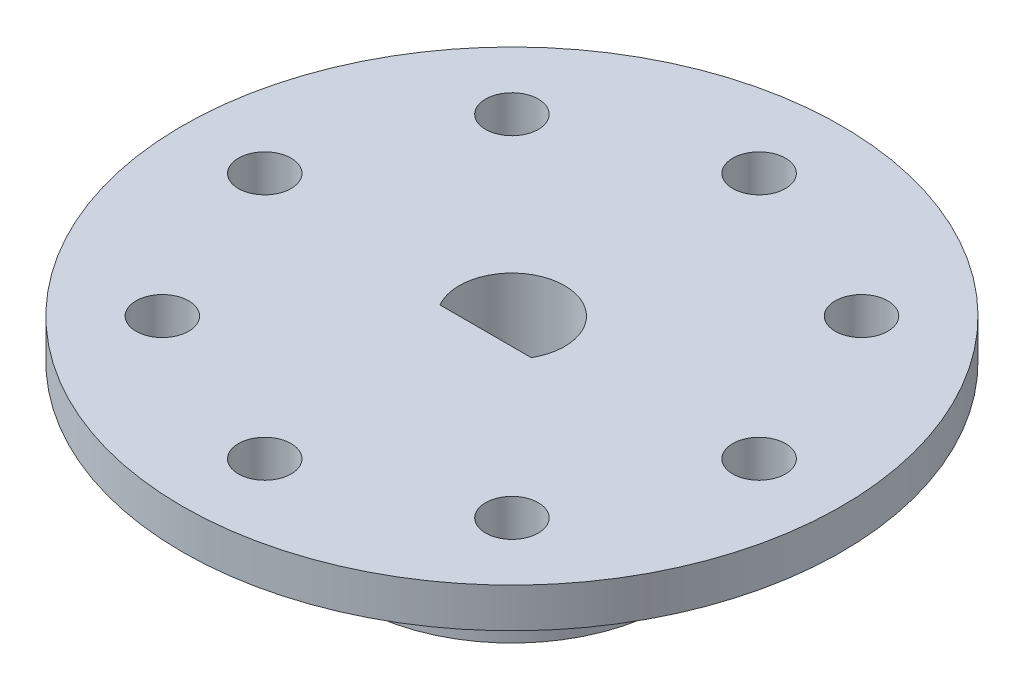
ISO-10303-21;
HEADER;
FILE_DESCRIPTION(('STEP AP214'),'2;1');
FILE_NAME('part.step','',(''),(''),'','','');
FILE_SCHEMA(('AUTOMOTIVE_DESIGN { 1 0 10303 214 1 1 1 1 }'));
ENDSEC;
DATA;
#1=APPLICATION_CONTEXT('core data for automotive mechanical design processes');
#2=APPLICATION_PROTOCOL_DEFINITION('international standard','automotive_design',2000,#1);
#3=PRODUCT_CONTEXT('',#1,'mechanical');
#4=PRODUCT('Part','Part','',(#3));
#5=PRODUCT_RELATED_PRODUCT_CATEGORY('part','',(#4));
#6=PRODUCT_DEFINITION_FORMATION('','',#4);
#7=PRODUCT_DEFINITION_CONTEXT('part definition',#1,'design');
#8=PRODUCT_DEFINITION('design','',#6,#7);
#9=PRODUCT_DEFINITION_SHAPE('','',#8);
#10=(LENGTH_UNIT() NAMED_UNIT(*) SI_UNIT(.MILLI.,.METRE.));
#11=(NAMED_UNIT(*) PLANE_ANGLE_UNIT() SI_UNIT($,.RADIAN.));
#12=(NAMED_UNIT(*) SI_UNIT($,.STERADIAN.) SOLID_ANGLE_UNIT());
#13=UNCERTAINTY_MEASURE_WITH_UNIT(LENGTH_MEASURE(1.E-05),#10,'distance_accuracy_value','');
#14=(GEOMETRIC_REPRESENTATION_CONTEXT(3) GLOBAL_UNCERTAINTY_ASSIGNED_CONTEXT((#13)) GLOBAL_UNIT_ASSIGNED_CONTEXT((#10,
#11,#12)) REPRESENTATION_CONTEXT('',''));
#15=CARTESIAN_POINT('',(0.,0.,0.));
#16=DIRECTION('',(0.,0.,1.));
#17=DIRECTION('',(1.,0.,0.));
#18=AXIS2_PLACEMENT_3D('',#15,#16,#17);
#19=CARTESIAN_POINT('',(0.,3.,0.));
#20=DIRECTION('',(0.,1.,0.));
#21=DIRECTION('',(0.,0.,1.));
#22=AXIS2_PLACEMENT_3D('',#19,#20,#21);
#23=PLANE('',#22);
#24=CARTESIAN_POINT('',(0.,3.,0.));
#25=DIRECTION('',(0.,-1.,0.));
#26=DIRECTION('',(0.,0.,-1.));
#27=AXIS2_PLACEMENT_3D('',#24,#25,#26);
#28=CIRCLE('',#27,4.);
#29=CARTESIAN_POINT('',(-3.46410161513775,3.,2.));
#30=VERTEX_POINT('',#29);
#31=CARTESIAN_POINT('',(3.46410161513775,3.,2.));
#32=VERTEX_POINT('',#31);
#33=EDGE_CURVE('E57',#30,#32,#28,.T.);
#34=ORIENTED_EDGE('',*,*,#33,.T.);
#35=DIRECTION('',(-1.,0.,0.));
#36=VECTOR('',#35,1.);
#37=CARTESIAN_POINT('',(-3.46410161513775,3.,2.));
#38=LINE('',#37,#36);
#39=EDGE_CURVE('E93',#32,#30,#38,.T.);
#40=ORIENTED_EDGE('',*,*,#39,.T.);
#41=EDGE_LOOP('',(#34,#40));
#42=FACE_BOUND('',#41,.T.);
#43=CARTESIAN_POINT('',(18.75,3.,0.));
#44=DIRECTION('',(0.,1.,0.));
#45=DIRECTION('',(0.,0.,-1.));
#46=AXIS2_PLACEMENT_3D('',#43,#44,#45);
#47=CIRCLE('',#46,2.);
#48=CARTESIAN_POINT('',(18.75,3.,-2.));
#49=VERTEX_POINT('',#48);
#50=EDGE_CURVE('E110',#49,#49,#47,.T.);
#51=ORIENTED_EDGE('',*,*,#50,.F.);
#52=EDGE_LOOP('',(#51));
#53=FACE_BOUND('',#52,.T.);
#54=CARTESIAN_POINT('',(-13.258252147248,3.,-13.2582521472479));
#55=DIRECTION('',(0.,1.,0.));
#56=DIRECTION('',(0.,0.,-1.));
#57=AXIS2_PLACEMENT_3D('',#54,#55,#56);
#58=CIRCLE('',#57,2.);
#59=CARTESIAN_POINT('',(-13.258252147248,3.,-15.2582521472479));
#60=VERTEX_POINT('',#59);
#61=EDGE_CURVE('E126',#60,#60,#58,.T.);
#62=ORIENTED_EDGE('',*,*,#61,.F.);
#63=EDGE_LOOP('',(#62));
#64=FACE_BOUND('',#63,.T.);
#65=CARTESIAN_POINT('',(-13.258252147248,3.,13.2582521472479));
#66=DIRECTION('',(0.,1.,0.));
#67=DIRECTION('',(0.,0.,1.));
#68=AXIS2_PLACEMENT_3D('',#65,#66,#67);
#69=CIRCLE('',#68,2.);
#70=CARTESIAN_POINT('',(-13.258252147248,3.,15.2582521472479));
#71=VERTEX_POINT('',#70);
#72=EDGE_CURVE('E142',#71,#71,#69,.T.);
#73=ORIENTED_EDGE('',*,*,#72,.F.);
#74=EDGE_LOOP('',(#73));
#75=FACE_BOUND('',#74,.T.);
#76=CARTESIAN_POINT('',(-18.75,3.,0.));
#77=DIRECTION('',(0.,1.,0.));
#78=DIRECTION('',(0.,0.,1.));
#79=AXIS2_PLACEMENT_3D('',#76,#77,#78);
#80=CIRCLE('',#79,2.);
#81=CARTESIAN_POINT('',(-18.75,3.,2.));
#82=VERTEX_POINT('',#81);
#83=EDGE_CURVE('E158',#82,#82,#80,.T.);
#84=ORIENTED_EDGE('',*,*,#83,.F.);
#85=EDGE_LOOP('',(#84));
#86=FACE_BOUND('',#85,.T.);
#87=CARTESIAN_POINT('',(0.,3.,0.));
#88=DIRECTION('',(0.,1.,0.));
#89=DIRECTION('',(0.,0.,1.));
#90=AXIS2_PLACEMENT_3D('',#87,#88,#89);
#91=CIRCLE('',#90,25.);
#92=CARTESIAN_POINT('',(0.,3.,25.));
#93=VERTEX_POINT('',#92);
#94=EDGE_CURVE('E49',#93,#93,#91,.T.);
#95=ORIENTED_EDGE('',*,*,#94,.T.);
#96=EDGE_LOOP('',(#95));
#97=FACE_BOUND('',#96,.T.);
#98=CARTESIAN_POINT('',(2.63677968348475E-13,3.,18.75));
#99=DIRECTION('',(0.,1.,0.));
#100=DIRECTION('',(0.,0.,-1.));
#101=AXIS2_PLACEMENT_3D('',#98,#99,#100);
#102=CIRCLE('',#101,2.00000000000014);
#103=CARTESIAN_POINT('',(2.63677968348475E-13,3.,16.7499999999999));
#104=VERTEX_POINT('',#103);
#105=EDGE_CURVE('E150',#104,#104,#102,.T.);
#106=ORIENTED_EDGE('',*,*,#105,.F.);
#107=EDGE_LOOP('',(#106));
#108=FACE_BOUND('',#107,.T.);
#109=CARTESIAN_POINT('',(2.63677968348475E-13,3.,-18.75));
#110=DIRECTION('',(0.,1.,0.));
#111=DIRECTION('',(0.,0.,1.));
#112=AXIS2_PLACEMENT_3D('',#109,#110,#111);
#113=CIRCLE('',#112,2.00000000000014);
#114=CARTESIAN_POINT('',(2.63677968348475E-13,3.,-16.7499999999999));
#115=VERTEX_POINT('',#114);
#116=EDGE_CURVE('E134',#115,#115,#113,.T.);
#117=ORIENTED_EDGE('',*,*,#116,.F.);
#118=EDGE_LOOP('',(#117));
#119=FACE_BOUND('',#118,.T.);
#120=CARTESIAN_POINT('',(13.258252147248,3.,-13.2582521472479));
#121=DIRECTION('',(0.,1.,0.));
#122=DIRECTION('',(0.,0.,1.));
#123=AXIS2_PLACEMENT_3D('',#120,#121,#122);
#124=CIRCLE('',#123,2.);
#125=CARTESIAN_POINT('',(13.258252147248,3.,-11.2582521472479));
#126=VERTEX_POINT('',#125);
#127=EDGE_CURVE('E118',#126,#126,#124,.T.);
#128=ORIENTED_EDGE('',*,*,#127,.F.);
#129=EDGE_LOOP('',(#128));
#130=FACE_BOUND('',#129,.T.);
#131=CARTESIAN_POINT('',(13.258252147248,3.,13.2582521472479));
#132=DIRECTION('',(0.,1.,0.));
#133=DIRECTION('',(0.,0.,-1.));
#134=AXIS2_PLACEMENT_3D('',#131,#132,#133);
#135=CIRCLE('',#134,2.);
#136=CARTESIAN_POINT('',(13.258252147248,3.,11.2582521472479));
#137=VERTEX_POINT('',#136);
#138=EDGE_CURVE('E102',#137,#137,#135,.T.);
#139=ORIENTED_EDGE('',*,*,#138,.F.);
#140=EDGE_LOOP('',(#139));
#141=FACE_BOUND('',#140,.T.);
#142=ADVANCED_FACE('F39',(#42,#53,#64,#75,#86,#97,#108,#119,#130,#141),#23,.T.);
#143=CARTESIAN_POINT('',(0.,0.,0.));
#144=DIRECTION('',(0.,1.,0.));
#145=DIRECTION('',(0.,0.,1.));
#146=AXIS2_PLACEMENT_3D('',#143,#144,#145);
#147=PLANE('',#146);
#148=CARTESIAN_POINT('',(0.,0.,0.));
#149=DIRECTION('',(0.,-1.,0.));
#150=DIRECTION('',(0.,0.,-1.));
#151=AXIS2_PLACEMENT_3D('',#148,#149,#150);
#152=CIRCLE('',#151,12.);
#153=CARTESIAN_POINT('',(0.,0.,-12.));
#154=VERTEX_POINT('',#153);
#155=EDGE_CURVE('E11',#154,#154,#152,.T.);
#156=ORIENTED_EDGE('',*,*,#155,.F.);
#157=EDGE_LOOP('',(#156));
#158=FACE_BOUND('',#157,.T.);
#159=CARTESIAN_POINT('',(0.,0.,0.));
#160=DIRECTION('',(0.,1.,0.));
#161=DIRECTION('',(0.,0.,1.));
#162=AXIS2_PLACEMENT_3D('',#159,#160,#161);
#163=CIRCLE('',#162,25.);
#164=CARTESIAN_POINT('',(0.,0.,25.));
#165=VERTEX_POINT('',#164);
#166=EDGE_CURVE('E43',#165,#165,#163,.T.);
#167=ORIENTED_EDGE('',*,*,#166,.F.);
#168=EDGE_LOOP('',(#167));
#169=FACE_BOUND('',#168,.T.);
#170=CARTESIAN_POINT('',(-18.75,0.,0.));
#171=DIRECTION('',(0.,1.,0.));
#172=DIRECTION('',(0.,0.,1.));
#173=AXIS2_PLACEMENT_3D('',#170,#171,#172);
#174=CIRCLE('',#173,2.);
#175=CARTESIAN_POINT('',(-18.75,0.,2.));
#176=VERTEX_POINT('',#175);
#177=EDGE_CURVE('E154',#176,#176,#174,.T.);
#178=ORIENTED_EDGE('',*,*,#177,.T.);
#179=EDGE_LOOP('',(#178));
#180=FACE_BOUND('',#179,.T.);
#181=CARTESIAN_POINT('',(2.63677968348475E-13,0.,18.75));
#182=DIRECTION('',(0.,1.,0.));
#183=DIRECTION('',(0.,0.,-1.));
#184=AXIS2_PLACEMENT_3D('',#181,#182,#183);
#185=CIRCLE('',#184,2.00000000000014);
#186=CARTESIAN_POINT('',(2.63677968348475E-13,0.,16.7499999999999));
#187=VERTEX_POINT('',#186);
#188=EDGE_CURVE('E146',#187,#187,#185,.T.);
#189=ORIENTED_EDGE('',*,*,#188,.T.);
#190=EDGE_LOOP('',(#189));
#191=FACE_BOUND('',#190,.T.);
#192=CARTESIAN_POINT('',(-13.258252147248,0.,13.2582521472479));
#193=DIRECTION('',(0.,1.,0.));
#194=DIRECTION('',(0.,0.,1.));
#195=AXIS2_PLACEMENT_3D('',#192,#193,#194);
#196=CIRCLE('',#195,2.);
#197=CARTESIAN_POINT('',(-13.258252147248,0.,15.2582521472479));
#198=VERTEX_POINT('',#197);
#199=EDGE_CURVE('E138',#198,#198,#196,.T.);
#200=ORIENTED_EDGE('',*,*,#199,.T.);
#201=EDGE_LOOP('',(#200));
#202=FACE_BOUND('',#201,.T.);
#203=CARTESIAN_POINT('',(2.63677968348475E-13,0.,-18.75));
#204=DIRECTION('',(0.,1.,0.));
#205=DIRECTION('',(0.,0.,1.));
#206=AXIS2_PLACEMENT_3D('',#203,#204,#205);
#207=CIRCLE('',#206,2.00000000000014);
#208=CARTESIAN_POINT('',(2.63677968348475E-13,0.,-16.7499999999999));
#209=VERTEX_POINT('',#208);
#210=EDGE_CURVE('E130',#209,#209,#207,.T.);
#211=ORIENTED_EDGE('',*,*,#210,.T.);
#212=EDGE_LOOP('',(#211));
#213=FACE_BOUND('',#212,.T.);
#214=CARTESIAN_POINT('',(-13.258252147248,0.,-13.2582521472479));
#215=DIRECTION('',(0.,1.,0.));
#216=DIRECTION('',(0.,0.,-1.));
#217=AXIS2_PLACEMENT_3D('',#214,#215,#216);
#218=CIRCLE('',#217,2.);
#219=CARTESIAN_POINT('',(-13.258252147248,0.,-15.2582521472479));
#220=VERTEX_POINT('',#219);
#221=EDGE_CURVE('E122',#220,#220,#218,.T.);
#222=ORIENTED_EDGE('',*,*,#221,.T.);
#223=EDGE_LOOP('',(#222));
#224=FACE_BOUND('',#223,.T.);
#225=CARTESIAN_POINT('',(13.258252147248,0.,-13.2582521472479));
#226=DIRECTION('',(0.,1.,0.));
#227=DIRECTION('',(0.,0.,1.));
#228=AXIS2_PLACEMENT_3D('',#225,#226,#227);
#229=CIRCLE('',#228,2.);
#230=CARTESIAN_POINT('',(13.258252147248,0.,-11.2582521472479));
#231=VERTEX_POINT('',#230);
#232=EDGE_CURVE('E114',#231,#231,#229,.T.);
#233=ORIENTED_EDGE('',*,*,#232,.T.);
#234=EDGE_LOOP('',(#233));
#235=FACE_BOUND('',#234,.T.);
#236=CARTESIAN_POINT('',(18.75,0.,0.));
#237=DIRECTION('',(0.,1.,0.));
#238=DIRECTION('',(0.,0.,-1.));
#239=AXIS2_PLACEMENT_3D('',#236,#237,#238);
#240=CIRCLE('',#239,2.);
#241=CARTESIAN_POINT('',(18.75,0.,-2.));
#242=VERTEX_POINT('',#241);
#243=EDGE_CURVE('E106',#242,#242,#240,.T.);
#244=ORIENTED_EDGE('',*,*,#243,.T.);
#245=EDGE_LOOP('',(#244));
#246=FACE_BOUND('',#245,.T.);
#247=CARTESIAN_POINT('',(13.258252147248,0.,13.2582521472479));
#248=DIRECTION('',(0.,1.,0.));
#249=DIRECTION('',(0.,0.,-1.));
#250=AXIS2_PLACEMENT_3D('',#247,#248,#249);
#251=CIRCLE('',#250,2.);
#252=CARTESIAN_POINT('',(13.258252147248,0.,11.2582521472479));
#253=VERTEX_POINT('',#252);
#254=EDGE_CURVE('E100',#253,#253,#251,.T.);
#255=ORIENTED_EDGE('',*,*,#254,.T.);
#256=EDGE_LOOP('',(#255));
#257=FACE_BOUND('',#256,.T.);
#258=ADVANCED_FACE('F173',(#158,#169,#180,#191,#202,#213,#224,#235,#246,#257),#147,.F.);
#259=CARTESIAN_POINT('',(0.,3.,0.));
#260=DIRECTION('',(0.,-1.,0.));
#261=DIRECTION('',(0.,0.,-1.));
#262=AXIS2_PLACEMENT_3D('',#259,#260,#261);
#263=CYLINDRICAL_SURFACE('',#262,25.);
#264=ORIENTED_EDGE('',*,*,#94,.F.);
#265=EDGE_LOOP('',(#264));
#266=FACE_BOUND('',#265,.T.);
#267=ORIENTED_EDGE('',*,*,#166,.T.);
#268=EDGE_LOOP('',(#267));
#269=FACE_BOUND('',#268,.T.);
#270=ADVANCED_FACE('F41',(#266,#269),#263,.T.);
#271=CARTESIAN_POINT('',(-18.75,3.,0.));
#272=DIRECTION('',(0.,-1.,0.));
#273=DIRECTION('',(0.,0.,-1.));
#274=AXIS2_PLACEMENT_3D('',#271,#272,#273);
#275=CYLINDRICAL_SURFACE('',#274,2.);
#276=ORIENTED_EDGE('',*,*,#83,.T.);
#277=EDGE_LOOP('',(#276));
#278=FACE_BOUND('',#277,.T.);
#279=ORIENTED_EDGE('',*,*,#177,.F.);
#280=EDGE_LOOP('',(#279));
#281=FACE_BOUND('',#280,.T.);
#282=ADVANCED_FACE('F215',(#278,#281),#275,.F.);
#283=CARTESIAN_POINT('',(2.63677968348475E-13,3.,18.75));
#284=DIRECTION('',(0.,-1.,0.));
#285=DIRECTION('',(0.,0.,-1.));
#286=AXIS2_PLACEMENT_3D('',#283,#284,#285);
#287=CYLINDRICAL_SURFACE('',#286,2.00000000000014);
#288=ORIENTED_EDGE('',*,*,#105,.T.);
#289=EDGE_LOOP('',(#288));
#290=FACE_BOUND('',#289,.T.);
#291=ORIENTED_EDGE('',*,*,#188,.F.);
#292=EDGE_LOOP('',(#291));
#293=FACE_BOUND('',#292,.T.);
#294=ADVANCED_FACE('F218',(#290,#293),#287,.F.);
#295=CARTESIAN_POINT('',(-13.258252147248,3.,13.2582521472479));
#296=DIRECTION('',(0.,-1.,0.));
#297=DIRECTION('',(0.,0.,-1.));
#298=AXIS2_PLACEMENT_3D('',#295,#296,#297);
#299=CYLINDRICAL_SURFACE('',#298,2.);
#300=ORIENTED_EDGE('',*,*,#72,.T.);
#301=EDGE_LOOP('',(#300));
#302=FACE_BOUND('',#301,.T.);
#303=ORIENTED_EDGE('',*,*,#199,.F.);
#304=EDGE_LOOP('',(#303));
#305=FACE_BOUND('',#304,.T.);
#306=ADVANCED_FACE('F222',(#302,#305),#299,.F.);
#307=CARTESIAN_POINT('',(2.63677968348475E-13,3.,-18.75));
#308=DIRECTION('',(0.,-1.,0.));
#309=DIRECTION('',(0.,0.,-1.));
#310=AXIS2_PLACEMENT_3D('',#307,#308,#309);
#311=CYLINDRICAL_SURFACE('',#310,2.00000000000014);
#312=ORIENTED_EDGE('',*,*,#116,.T.);
#313=EDGE_LOOP('',(#312));
#314=FACE_BOUND('',#313,.T.);
#315=ORIENTED_EDGE('',*,*,#210,.F.);
#316=EDGE_LOOP('',(#315));
#317=FACE_BOUND('',#316,.T.);
#318=ADVANCED_FACE('F226',(#314,#317),#311,.F.);
#319=CARTESIAN_POINT('',(-13.258252147248,3.,-13.2582521472479));
#320=DIRECTION('',(0.,-1.,0.));
#321=DIRECTION('',(0.,0.,-1.));
#322=AXIS2_PLACEMENT_3D('',#319,#320,#321);
#323=CYLINDRICAL_SURFACE('',#322,2.);
#324=ORIENTED_EDGE('',*,*,#61,.T.);
#325=EDGE_LOOP('',(#324));
#326=FACE_BOUND('',#325,.T.);
#327=ORIENTED_EDGE('',*,*,#221,.F.);
#328=EDGE_LOOP('',(#327));
#329=FACE_BOUND('',#328,.T.);
#330=ADVANCED_FACE('F230',(#326,#329),#323,.F.);
#331=CARTESIAN_POINT('',(13.258252147248,3.,-13.2582521472479));
#332=DIRECTION('',(0.,-1.,0.));
#333=DIRECTION('',(0.,0.,-1.));
#334=AXIS2_PLACEMENT_3D('',#331,#332,#333);
#335=CYLINDRICAL_SURFACE('',#334,2.);
#336=ORIENTED_EDGE('',*,*,#127,.T.);
#337=EDGE_LOOP('',(#336));
#338=FACE_BOUND('',#337,.T.);
#339=ORIENTED_EDGE('',*,*,#232,.F.);
#340=EDGE_LOOP('',(#339));
#341=FACE_BOUND('',#340,.T.);
#342=ADVANCED_FACE('F205',(#338,#341),#335,.F.);
#343=CARTESIAN_POINT('',(18.75,3.,0.));
#344=DIRECTION('',(0.,-1.,0.));
#345=DIRECTION('',(0.,0.,-1.));
#346=AXIS2_PLACEMENT_3D('',#343,#344,#345);
#347=CYLINDRICAL_SURFACE('',#346,2.);
#348=ORIENTED_EDGE('',*,*,#50,.T.);
#349=EDGE_LOOP('',(#348));
#350=FACE_BOUND('',#349,.T.);
#351=ORIENTED_EDGE('',*,*,#243,.F.);
#352=EDGE_LOOP('',(#351));
#353=FACE_BOUND('',#352,.T.);
#354=ADVANCED_FACE('F196',(#350,#353),#347,.F.);
#355=CARTESIAN_POINT('',(13.258252147248,3.,13.2582521472479));
#356=DIRECTION('',(0.,-1.,0.));
#357=DIRECTION('',(0.,0.,-1.));
#358=AXIS2_PLACEMENT_3D('',#355,#356,#357);
#359=CYLINDRICAL_SURFACE('',#358,2.);
#360=ORIENTED_EDGE('',*,*,#138,.T.);
#361=EDGE_LOOP('',(#360));
#362=FACE_BOUND('',#361,.T.);
#363=ORIENTED_EDGE('',*,*,#254,.F.);
#364=EDGE_LOOP('',(#363));
#365=FACE_BOUND('',#364,.T.);
#366=ADVANCED_FACE('F193',(#362,#365),#359,.F.);
#367=CARTESIAN_POINT('',(0.,-10.,0.));
#368=DIRECTION('',(0.,1.,0.));
#369=DIRECTION('',(0.,0.,1.));
#370=AXIS2_PLACEMENT_3D('',#367,#368,#369);
#371=CYLINDRICAL_SURFACE('',#370,12.);
#372=CARTESIAN_POINT('',(0.,-6.5,12.));
#373=CARTESIAN_POINT('',(-0.0839046573334568,-6.49999643543857,11.9999988293786));
#374=CARTESIAN_POINT('',(-0.167861744581648,-6.49293627249843,11.9991107073294));
#375=CARTESIAN_POINT('',(-0.333439681253852,-6.46488334725752,11.9956532406682));
#376=CARTESIAN_POINT('',(-0.415057998374247,-6.44387603724597,11.9930821406486));
#377=CARTESIAN_POINT('',(-0.573537344887833,-6.38855741365155,11.9865483662664));
#378=CARTESIAN_POINT('',(-0.650401536087683,-6.35425505491409,11.9825866287333));
#379=CARTESIAN_POINT('',(-0.797267684935822,-6.27333962961812,11.9737122052686));
#380=CARTESIAN_POINT('',(-0.867270816933823,-6.22672867488157,11.9687996825047));
#381=CARTESIAN_POINT('',(-0.99882769015879,-6.12224483009625,11.958541927838));
#382=CARTESIAN_POINT('',(-1.06033821896228,-6.06431772239226,11.9531946881545));
#383=CARTESIAN_POINT('',(-1.1727916761345,-5.93896230587801,11.9426863560585));
#384=CARTESIAN_POINT('',(-1.22373406583535,-5.87153351305205,11.9375252731456));
#385=CARTESIAN_POINT('',(-1.31376609677036,-5.7288080134606,11.9279538337175));
#386=CARTESIAN_POINT('',(-1.35281525756464,-5.65348558305923,11.9235460630675));
#387=CARTESIAN_POINT('',(-1.41769384594507,-5.49728776883158,11.9160067707461));
#388=CARTESIAN_POINT('',(-1.44352377483913,-5.41641259571179,11.9128752006788));
#389=CARTESIAN_POINT('',(-1.48109938801486,-5.25185348264794,11.9082620376217));
#390=CARTESIAN_POINT('',(-1.49291802883902,-5.16818644537748,11.9067719006205));
#391=CARTESIAN_POINT('',(-1.50236132973434,-5.0000442419169,11.9055841688568));
#392=CARTESIAN_POINT('',(-1.49998656060145,-4.91556910836123,11.9058865020091));
#393=CARTESIAN_POINT('',(-1.48117034186874,-4.74871710365073,11.9082417322185));
#394=CARTESIAN_POINT('',(-1.46480925779082,-4.66633100827984,11.910284627762));
#395=CARTESIAN_POINT('',(-1.41861022990923,-4.50548298726861,11.9158751985458));
#396=CARTESIAN_POINT('',(-1.38877201305114,-4.42702114117158,11.9194229042743));
#397=CARTESIAN_POINT('',(-1.31637933594699,-4.27599920058699,11.9276346951879));
#398=CARTESIAN_POINT('',(-1.27378995222458,-4.20345601985061,11.9323018392687));
#399=CARTESIAN_POINT('',(-1.17712888167415,-4.06651598335205,11.9422242685836));
#400=CARTESIAN_POINT('',(-1.12305666964847,-4.00211950041579,11.947479580714));
#401=CARTESIAN_POINT('',(-1.00451946645227,-3.88283437356636,11.9580306593426));
#402=CARTESIAN_POINT('',(-0.939985204704007,-3.82801454494041,11.9633264543213));
#403=CARTESIAN_POINT('',(-0.802594301468354,-3.72997467198167,11.9733277953351));
#404=CARTESIAN_POINT('',(-0.729737640790951,-3.6867546543968,11.978033340009));
#405=CARTESIAN_POINT('',(-0.577717002818088,-3.61314120772165,11.9863269133115));
#406=CARTESIAN_POINT('',(-0.49855091720263,-3.58275208767126,11.9899145664092));
#407=CARTESIAN_POINT('',(-0.336184764258633,-3.53571770388605,11.9955647146804));
#408=CARTESIAN_POINT('',(-0.2529848859784,-3.51907179671777,11.9976272812552));
#409=CARTESIAN_POINT('',(-0.0855078983480977,-3.50008554544367,11.9999855784646));
#410=CARTESIAN_POINT('',(-0.00124169411916367,-3.49765040458156,12.0002930168558));
#411=CARTESIAN_POINT('',(0.166497621898498,-3.50690464043357,11.9991380280326));
#412=CARTESIAN_POINT('',(0.249970750538825,-3.51859371635096,11.9976756385093));
#413=CARTESIAN_POINT('',(0.413474704632914,-3.55568582526463,11.9931526125402));
#414=CARTESIAN_POINT('',(0.493515942254824,-3.58104365804158,11.9900972448832));
#415=CARTESIAN_POINT('',(0.648209792915045,-3.64470647114775,11.9827303386012));
#416=CARTESIAN_POINT('',(0.722862222879189,-3.68301189109486,11.9784187573237));
#417=CARTESIAN_POINT('',(0.865082712412457,-3.77171188250448,11.9689909374607));
#418=CARTESIAN_POINT('',(0.932612255966292,-3.82216777388338,11.9638706642551));
#419=CARTESIAN_POINT('',(1.05827819377579,-3.93364969852052,11.9534108539539));
#420=CARTESIAN_POINT('',(1.11641421500212,-3.99467615135059,11.9480713081614));
#421=CARTESIAN_POINT('',(1.22197917529081,-4.12598445005428,11.9377386327755));
#422=CARTESIAN_POINT('',(1.26934527634076,-4.19631700778624,11.932747648328));
#423=CARTESIAN_POINT('',(1.3515917336661,-4.34399494691283,11.9237124662229));
#424=CARTESIAN_POINT('',(1.38647234023702,-4.42134018768591,11.9196682495862));
#425=CARTESIAN_POINT('',(1.44265594731993,-4.58064519148857,11.912999102358));
#426=CARTESIAN_POINT('',(1.46399437647427,-4.66259229802878,11.9103704711087));
#427=CARTESIAN_POINT('',(1.49260199632071,-4.8289414902684,11.9068194954447));
#428=CARTESIAN_POINT('',(1.49987184152146,-4.9133434615754,11.9058970716527));
#429=CARTESIAN_POINT('',(1.5001239216509,-5.08158135752281,11.9058652618947));
#430=CARTESIAN_POINT('',(1.49320487861956,-5.16541714899913,11.9067433485117));
#431=CARTESIAN_POINT('',(1.4654846429096,-5.33072427760705,11.9101866872232));
#432=CARTESIAN_POINT('',(1.44468344874346,-5.41219561448528,11.9127519394985));
#433=CARTESIAN_POINT('',(1.38982024421379,-5.57044817405984,11.9192766946473));
#434=CARTESIAN_POINT('',(1.35576298858256,-5.64723106701309,11.9232356975567));
#435=CARTESIAN_POINT('',(1.27536414129019,-5.79400799242899,11.9321026994689));
#436=CARTESIAN_POINT('',(1.22902239570575,-5.8640019398119,11.9370107103625));
#437=CARTESIAN_POINT('',(1.1250037987595,-5.99571873520429,11.9472636285134));
#438=CARTESIAN_POINT('',(1.06725337546498,-6.05738327657299,11.9526112325042));
#439=CARTESIAN_POINT('',(0.94221013618103,-6.17018409510078,11.9631169895574));
#440=CARTESIAN_POINT('',(0.87491507348494,-6.22131788646459,11.9682750976535));
#441=CARTESIAN_POINT('',(0.732399372512527,-6.31177121426318,11.9778423395205));
#442=CARTESIAN_POINT('',(0.657149567757702,-6.35104508353955,11.9822485504698));
#443=CARTESIAN_POINT('',(0.501109741380769,-6.41634274574977,11.9897858944604));
#444=CARTESIAN_POINT('',(0.420325848522142,-6.44238093581208,11.9929184122175));
#445=CARTESIAN_POINT('',(0.282603463180755,-6.47423560290278,11.9968003219665));
#446=CARTESIAN_POINT('',(0.226533398110153,-6.48388336518924,11.9979943553727));
#447=CARTESIAN_POINT('',(0.113650237927461,-6.49676674741593,11.9995945879751));
#448=CARTESIAN_POINT('',(0.0568371482976164,-6.50000241463958,12.0000007929808));
#449=CARTESIAN_POINT('',(0.,-6.5,12.));
#450=B_SPLINE_CURVE_WITH_KNOTS('',3,(#372,#373,#374,#375,#376,#377,#378,#379,#380,#381,#382,
#383,#384,#385,#386,#387,#388,#389,#390,#391,#392,#393,#394,#395,#396,#397,#398,#399,#400,#401,
#402,#403,#404,#405,#406,#407,#408,#409,#410,#411,#412,#413,#414,#415,#416,#417,#418,#419,#420,
#421,#422,#423,#424,#425,#426,#427,#428,#429,#430,#431,#432,#433,#434,#435,#436,#437,#438,#439,
#440,#441,#442,#443,#444,#445,#446,#447,#448,#449),.UNSPECIFIED.,.T.,.F.,(4,2,2,2,2,2,2,2,2,2,2,
2,2,2,2,2,2,2,2,2,2,2,2,2,2,2,2,2,2,2,2,2,2,2,2,2,2,2,4),(0.,0.251506363665748,
0.503275476566056,0.754875304909063,1.00643199354644,1.25922487921106,1.51203064680006,
1.76568750191322,2.01933473698084,2.27165535171792,2.52396581930798,2.77483617865015,
3.02571162099745,3.2772805577132,3.52886100308183,3.7821808688185,4.03550131867868,
4.28890677438963,4.54230036542268,4.79400167635153,5.04569762701157,5.29656632336037,
5.54744353847368,5.79961441757053,6.05179530825053,6.30541182904544,6.55902326532923,
6.81196844568555,7.06490185806374,7.31608140721329,7.56726098327729,7.81835054823893,
8.06944325947358,8.32221142615098,8.57503919082008,8.82882841822112,9.0823409921042,
9.25271305912577,9.42308386980262),.UNSPECIFIED.);
#451=CARTESIAN_POINT('',(0.,-6.5,12.));
#452=VERTEX_POINT('',#451);
#453=EDGE_CURVE('E86',#452,#452,#450,.T.);
#454=ORIENTED_EDGE('',*,*,#453,.T.);
#455=EDGE_LOOP('',(#454));
#456=FACE_BOUND('',#455,.T.);
#457=CARTESIAN_POINT('',(0.,-10.,0.));
#458=DIRECTION('',(0.,-1.,0.));
#459=DIRECTION('',(0.,0.,-1.));
#460=AXIS2_PLACEMENT_3D('',#457,#458,#459);
#461=CIRCLE('',#460,12.);
#462=CARTESIAN_POINT('',(0.,-10.,-12.));
#463=VERTEX_POINT('',#462);
#464=EDGE_CURVE('E74',#463,#463,#461,.T.);
#465=ORIENTED_EDGE('',*,*,#464,.F.);
#466=EDGE_LOOP('',(#465));
#467=FACE_BOUND('',#466,.T.);
#468=ORIENTED_EDGE('',*,*,#155,.T.);
#469=EDGE_LOOP('',(#468));
#470=FACE_BOUND('',#469,.T.);
#471=ADVANCED_FACE('F195',(#456,#467,#470),#371,.T.);
#472=CARTESIAN_POINT('',(0.,-10.,0.));
#473=DIRECTION('',(0.,-1.,0.));
#474=DIRECTION('',(0.,0.,-1.));
#475=AXIS2_PLACEMENT_3D('',#472,#473,#474);
#476=PLANE('',#475);
#477=CARTESIAN_POINT('',(0.,-10.,0.));
#478=DIRECTION('',(0.,-1.,0.));
#479=DIRECTION('',(0.,0.,-1.));
#480=AXIS2_PLACEMENT_3D('',#477,#478,#479);
#481=CIRCLE('',#480,4.);
#482=CARTESIAN_POINT('',(-3.46410161513775,-10.,2.));
#483=VERTEX_POINT('',#482);
#484=CARTESIAN_POINT('',(3.46410161513775,-10.,2.));
#485=VERTEX_POINT('',#484);
#486=EDGE_CURVE('E62',#483,#485,#481,.T.);
#487=ORIENTED_EDGE('',*,*,#486,.F.);
#488=DIRECTION('',(-1.,0.,0.));
#489=VECTOR('',#488,1.);
#490=CARTESIAN_POINT('',(-3.46410161513775,-10.,2.));
#491=LINE('',#490,#489);
#492=EDGE_CURVE('E78',#485,#483,#491,.T.);
#493=ORIENTED_EDGE('',*,*,#492,.F.);
#494=EDGE_LOOP('',(#487,#493));
#495=FACE_BOUND('',#494,.T.);
#496=ORIENTED_EDGE('',*,*,#464,.T.);
#497=EDGE_LOOP('',(#496));
#498=FACE_BOUND('',#497,.T.);
#499=ADVANCED_FACE('F83',(#495,#498),#476,.T.);
#500=CARTESIAN_POINT('',(0.,3.,0.));
#501=DIRECTION('',(0.,-1.,0.));
#502=DIRECTION('',(0.,0.,-1.));
#503=AXIS2_PLACEMENT_3D('',#500,#501,#502);
#504=CYLINDRICAL_SURFACE('',#503,4.);
#505=ORIENTED_EDGE('',*,*,#486,.T.);
#506=DIRECTION('',(0.,-1.,0.));
#507=VECTOR('',#506,1.);
#508=CARTESIAN_POINT('',(3.46410161513775,3.,2.));
#509=LINE('',#508,#507);
#510=EDGE_CURVE('E75',#32,#485,#509,.T.);
#511=ORIENTED_EDGE('',*,*,#510,.F.);
#512=ORIENTED_EDGE('',*,*,#33,.F.);
#513=DIRECTION('',(0.,-1.,0.));
#514=VECTOR('',#513,1.);
#515=CARTESIAN_POINT('',(-3.46410161513775,3.,2.));
#516=LINE('',#515,#514);
#517=EDGE_CURVE('E67',#30,#483,#516,.T.);
#518=ORIENTED_EDGE('',*,*,#517,.T.);
#519=EDGE_LOOP('',(#505,#511,#512,#518));
#520=FACE_BOUND('',#519,.T.);
#521=ADVANCED_FACE('F69',(#520),#504,.F.);
#522=CARTESIAN_POINT('',(-3.46410161513775,3.,2.));
#523=DIRECTION('',(0.,0.,1.));
#524=DIRECTION('',(1.,0.,0.));
#525=AXIS2_PLACEMENT_3D('',#522,#523,#524);
#526=PLANE('',#525);
#527=CARTESIAN_POINT('',(0.,-5.,2.));
#528=DIRECTION('',(0.,0.,-1.));
#529=DIRECTION('',(-1.,0.,0.));
#530=AXIS2_PLACEMENT_3D('',#527,#528,#529);
#531=CIRCLE('',#530,1.5);
#532=CARTESIAN_POINT('',(-1.5,-5.,2.));
#533=VERTEX_POINT('',#532);
#534=EDGE_CURVE('E90',#533,#533,#531,.T.);
#535=ORIENTED_EDGE('',*,*,#534,.F.);
#536=EDGE_LOOP('',(#535));
#537=FACE_BOUND('',#536,.T.);
#538=ORIENTED_EDGE('',*,*,#492,.T.);
#539=ORIENTED_EDGE('',*,*,#517,.F.);
#540=ORIENTED_EDGE('',*,*,#39,.F.);
#541=ORIENTED_EDGE('',*,*,#510,.T.);
#542=EDGE_LOOP('',(#538,#539,#540,#541));
#543=FACE_BOUND('',#542,.T.);
#544=ADVANCED_FACE('F79',(#537,#543),#526,.F.);
#545=CARTESIAN_POINT('',(0.,-5.,25.));
#546=DIRECTION('',(0.,0.,-1.));
#547=DIRECTION('',(-1.,0.,0.));
#548=AXIS2_PLACEMENT_3D('',#545,#546,#547);
#549=CYLINDRICAL_SURFACE('',#548,1.5);
#550=ORIENTED_EDGE('',*,*,#534,.T.);
#551=EDGE_LOOP('',(#550));
#552=FACE_BOUND('',#551,.T.);
#553=ORIENTED_EDGE('',*,*,#453,.F.);
#554=EDGE_LOOP('',(#553));
#555=FACE_BOUND('',#554,.T.);
#556=ADVANCED_FACE('F297',(#552,#555),#549,.F.);
#557=CLOSED_SHELL('',(#142,#258,#270,#282,#294,#306,#318,#330,#342,#354,#366,#471,#499,#521,
#544,#556));
#558=MANIFOLD_SOLID_BREP('B2',#557);
#559=ADVANCED_BREP_SHAPE_REPRESENTATION('',(#18,#558),#14);
#560=SHAPE_DEFINITION_REPRESENTATION(#9,#559);
ENDSEC;
END-ISO-10303-21;
